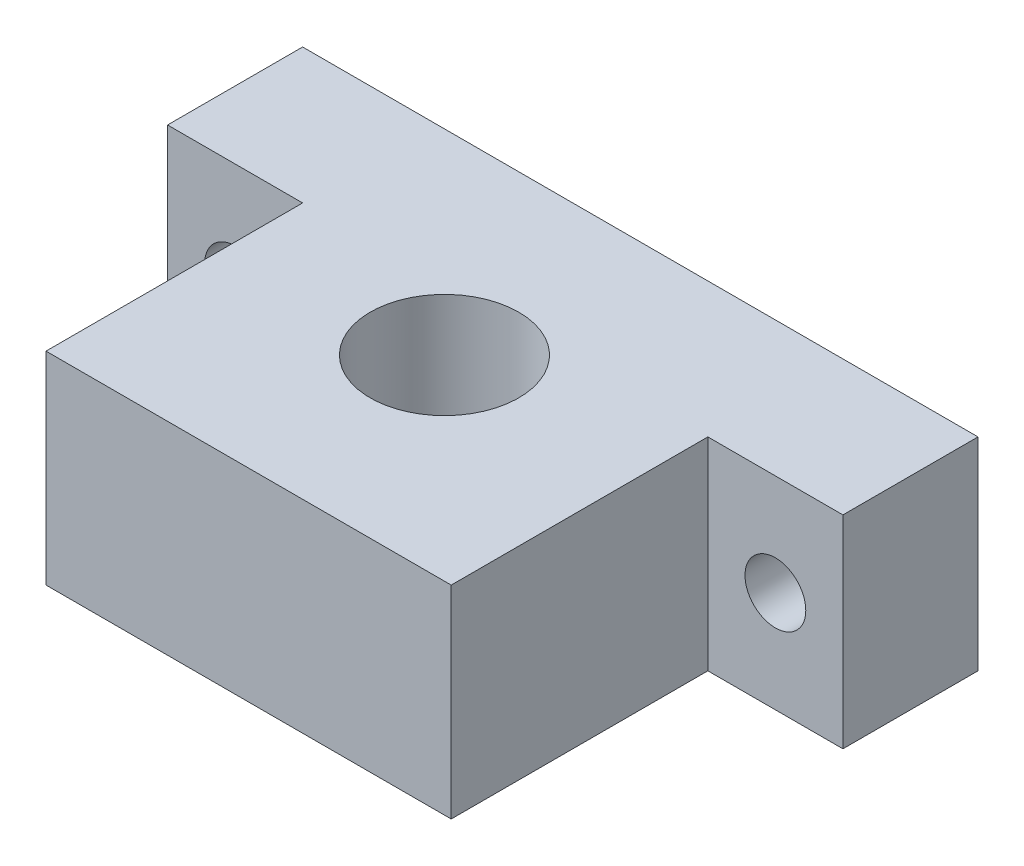
ISO-10303-21;
HEADER;
FILE_DESCRIPTION(('STEP AP214'),'2;1');
FILE_NAME('part.step','',(''),(''),'','','');
FILE_SCHEMA(('AUTOMOTIVE_DESIGN { 1 0 10303 214 1 1 1 1 }'));
ENDSEC;
DATA;
#1=APPLICATION_CONTEXT('core data for automotive mechanical design processes');
#2=APPLICATION_PROTOCOL_DEFINITION('international standard','automotive_design',2000,#1);
#3=PRODUCT_CONTEXT('',#1,'mechanical');
#4=PRODUCT('Part','Part','',(#3));
#5=PRODUCT_RELATED_PRODUCT_CATEGORY('part','',(#4));
#6=PRODUCT_DEFINITION_FORMATION('','',#4);
#7=PRODUCT_DEFINITION_CONTEXT('part definition',#1,'design');
#8=PRODUCT_DEFINITION('design','',#6,#7);
#9=PRODUCT_DEFINITION_SHAPE('','',#8);
#10=(LENGTH_UNIT() NAMED_UNIT(*) SI_UNIT(.MILLI.,.METRE.));
#11=(NAMED_UNIT(*) PLANE_ANGLE_UNIT() SI_UNIT($,.RADIAN.));
#12=(NAMED_UNIT(*) SI_UNIT($,.STERADIAN.) SOLID_ANGLE_UNIT());
#13=UNCERTAINTY_MEASURE_WITH_UNIT(LENGTH_MEASURE(1.E-05),#10,'distance_accuracy_value','');
#14=(GEOMETRIC_REPRESENTATION_CONTEXT(3) GLOBAL_UNCERTAINTY_ASSIGNED_CONTEXT((#13)) GLOBAL_UNIT_ASSIGNED_CONTEXT((#10,
#11,#12)) REPRESENTATION_CONTEXT('',''));
#15=CARTESIAN_POINT('',(0.,0.,0.));
#16=DIRECTION('',(0.,0.,1.));
#17=DIRECTION('',(1.,0.,0.));
#18=AXIS2_PLACEMENT_3D('',#15,#16,#17);
#19=CARTESIAN_POINT('',(35.873439743085,674.486311853786,132.704036074085));
#20=DIRECTION('',(-1.,0.,0.));
#21=DIRECTION('',(0.,0.,1.));
#22=AXIS2_PLACEMENT_3D('',#19,#20,#21);
#23=PLANE('',#22);
#24=DIRECTION('',(0.,-1.,0.));
#25=VECTOR('',#24,1.);
#26=CARTESIAN_POINT('',(35.873439743085,704.486311853786,-9.69902901502091));
#27=LINE('',#26,#25);
#28=CARTESIAN_POINT('',(35.873439743085,704.486311853786,-9.69902901502091));
#29=VERTEX_POINT('',#28);
#30=CARTESIAN_POINT('',(35.873439743085,674.486311853786,-9.69902901502091));
#31=VERTEX_POINT('',#30);
#32=EDGE_CURVE('E182',#29,#31,#27,.T.);
#33=ORIENTED_EDGE('',*,*,#32,.T.);
#34=DIRECTION('',(0.,0.,-1.));
#35=VECTOR('',#34,1.);
#36=CARTESIAN_POINT('',(35.873439743085,674.486311853786,132.704036074085));
#37=LINE('',#36,#35);
#38=CARTESIAN_POINT('',(35.873439743085,674.486311853786,-29.6990290150209));
#39=VERTEX_POINT('',#38);
#40=EDGE_CURVE('E147',#31,#39,#37,.T.);
#41=ORIENTED_EDGE('',*,*,#40,.T.);
#42=DIRECTION('',(0.,1.,0.));
#43=VECTOR('',#42,1.);
#44=CARTESIAN_POINT('',(35.873439743085,674.486311853786,-29.6990290150209));
#45=LINE('',#44,#43);
#46=CARTESIAN_POINT('',(35.873439743085,704.486311853786,-29.6990290150209));
#47=VERTEX_POINT('',#46);
#48=EDGE_CURVE('E144',#39,#47,#45,.T.);
#49=ORIENTED_EDGE('',*,*,#48,.T.);
#50=DIRECTION('',(0.,0.,-1.));
#51=VECTOR('',#50,1.);
#52=CARTESIAN_POINT('',(35.873439743085,704.486311853786,132.704036074085));
#53=LINE('',#52,#51);
#54=EDGE_CURVE('E143',#29,#47,#53,.T.);
#55=ORIENTED_EDGE('',*,*,#54,.F.);
#56=EDGE_LOOP('',(#33,#41,#49,#55));
#57=FACE_BOUND('',#56,.T.);
#58=ADVANCED_FACE('F35',(#57),#23,.F.);
#59=CARTESIAN_POINT('',(-64.1265602569151,704.486311853786,132.704036074085));
#60=DIRECTION('',(1.,0.,0.));
#61=DIRECTION('',(0.,0.,-1.));
#62=AXIS2_PLACEMENT_3D('',#59,#60,#61);
#63=PLANE('',#62);
#64=DIRECTION('',(0.,1.,0.));
#65=VECTOR('',#64,1.);
#66=CARTESIAN_POINT('',(-64.126560256915,704.486311853786,-9.69902901502091));
#67=LINE('',#66,#65);
#68=CARTESIAN_POINT('',(-64.1265602569151,674.486311853786,-9.69902901502091));
#69=VERTEX_POINT('',#68);
#70=CARTESIAN_POINT('',(-64.126560256915,704.486311853786,-9.69902901502091));
#71=VERTEX_POINT('',#70);
#72=EDGE_CURVE('E127',#69,#71,#67,.T.);
#73=ORIENTED_EDGE('',*,*,#72,.T.);
#74=DIRECTION('',(0.,0.,-1.));
#75=VECTOR('',#74,1.);
#76=CARTESIAN_POINT('',(-64.1265602569151,704.486311853786,132.704036074085));
#77=LINE('',#76,#75);
#78=CARTESIAN_POINT('',(-64.1265602569151,704.486311853786,-29.6990290150209));
#79=VERTEX_POINT('',#78);
#80=EDGE_CURVE('E39',#71,#79,#77,.T.);
#81=ORIENTED_EDGE('',*,*,#80,.T.);
#82=DIRECTION('',(0.,-1.,0.));
#83=VECTOR('',#82,1.);
#84=CARTESIAN_POINT('',(-64.1265602569151,704.486311853786,-29.6990290150209));
#85=LINE('',#84,#83);
#86=CARTESIAN_POINT('',(-64.1265602569151,674.486311853786,-29.6990290150209));
#87=VERTEX_POINT('',#86);
#88=EDGE_CURVE('E152',#79,#87,#85,.T.);
#89=ORIENTED_EDGE('',*,*,#88,.T.);
#90=DIRECTION('',(0.,0.,-1.));
#91=VECTOR('',#90,1.);
#92=CARTESIAN_POINT('',(-64.1265602569151,674.486311853786,132.704036074085));
#93=LINE('',#92,#91);
#94=EDGE_CURVE('E151',#69,#87,#93,.T.);
#95=ORIENTED_EDGE('',*,*,#94,.F.);
#96=EDGE_LOOP('',(#73,#81,#89,#95));
#97=FACE_BOUND('',#96,.T.);
#98=ADVANCED_FACE('F174',(#97),#63,.F.);
#99=CARTESIAN_POINT('',(-14.1265602569151,674.486311853786,132.704036074085));
#100=DIRECTION('',(0.,1.,0.));
#101=DIRECTION('',(0.,0.,1.));
#102=AXIS2_PLACEMENT_3D('',#99,#100,#101);
#103=PLANE('',#102);
#104=CARTESIAN_POINT('',(-14.126560256915,674.486311853786,-0.699029015020905));
#105=DIRECTION('',(0.,-1.,0.));
#106=DIRECTION('',(0.,0.,-1.));
#107=AXIS2_PLACEMENT_3D('',#104,#105,#106);
#108=CIRCLE('',#107,11.);
#109=CARTESIAN_POINT('',(-14.126560256915,674.486311853786,-11.6990290150209));
#110=VERTEX_POINT('',#109);
#111=EDGE_CURVE('E134',#110,#110,#108,.T.);
#112=ORIENTED_EDGE('',*,*,#111,.F.);
#113=EDGE_LOOP('',(#112));
#114=FACE_BOUND('',#113,.T.);
#115=DIRECTION('',(-1.,0.,0.));
#116=VECTOR('',#115,1.);
#117=CARTESIAN_POINT('',(35.873439743085,674.486311853786,-9.69902901502091));
#118=LINE('',#117,#116);
#119=CARTESIAN_POINT('',(15.8734397430849,674.486311853786,-9.69902901502091));
#120=VERTEX_POINT('',#119);
#121=EDGE_CURVE('E114',#31,#120,#118,.T.);
#122=ORIENTED_EDGE('',*,*,#121,.T.);
#123=DIRECTION('',(0.,0.,1.));
#124=VECTOR('',#123,1.);
#125=CARTESIAN_POINT('',(15.8734397430849,674.486311853786,-65.7545417696608));
#126=LINE('',#125,#124);
#127=CARTESIAN_POINT('',(15.8734397430849,674.486311853786,28.3009709849791));
#128=VERTEX_POINT('',#127);
#129=EDGE_CURVE('E103',#120,#128,#126,.T.);
#130=ORIENTED_EDGE('',*,*,#129,.T.);
#131=DIRECTION('',(1.,0.,0.));
#132=VECTOR('',#131,1.);
#133=CARTESIAN_POINT('',(-14.1265602569151,674.486311853786,28.3009709849791));
#134=LINE('',#133,#132);
#135=CARTESIAN_POINT('',(-44.126560256915,674.486311853786,28.3009709849791));
#136=VERTEX_POINT('',#135);
#137=EDGE_CURVE('E12',#136,#128,#134,.T.);
#138=ORIENTED_EDGE('',*,*,#137,.F.);
#139=DIRECTION('',(0.,0.,1.));
#140=VECTOR('',#139,1.);
#141=CARTESIAN_POINT('',(-44.126560256915,674.486311853786,-65.7545417696608));
#142=LINE('',#141,#140);
#143=CARTESIAN_POINT('',(-44.126560256915,674.486311853786,-9.69902901502091));
#144=VERTEX_POINT('',#143);
#145=EDGE_CURVE('E60',#144,#136,#142,.T.);
#146=ORIENTED_EDGE('',*,*,#145,.F.);
#147=DIRECTION('',(-1.,0.,0.));
#148=VECTOR('',#147,1.);
#149=CARTESIAN_POINT('',(-64.1265602569151,674.486311853786,-9.69902901502091));
#150=LINE('',#149,#148);
#151=EDGE_CURVE('E131',#144,#69,#150,.T.);
#152=ORIENTED_EDGE('',*,*,#151,.T.);
#153=ORIENTED_EDGE('',*,*,#94,.T.);
#154=DIRECTION('',(1.,0.,0.));
#155=VECTOR('',#154,1.);
#156=CARTESIAN_POINT('',(-14.1265602569151,674.486311853786,-29.6990290150209));
#157=LINE('',#156,#155);
#158=EDGE_CURVE('E148',#87,#39,#157,.T.);
#159=ORIENTED_EDGE('',*,*,#158,.T.);
#160=ORIENTED_EDGE('',*,*,#40,.F.);
#161=EDGE_LOOP('',(#122,#130,#138,#146,#152,#153,#159,#160));
#162=FACE_BOUND('',#161,.T.);
#163=ADVANCED_FACE('F112',(#114,#162),#103,.F.);
#164=CARTESIAN_POINT('',(35.873439743085,704.486311853786,132.704036074085));
#165=DIRECTION('',(0.,-1.,0.));
#166=DIRECTION('',(0.,0.,-1.));
#167=AXIS2_PLACEMENT_3D('',#164,#165,#166);
#168=PLANE('',#167);
#169=CARTESIAN_POINT('',(-14.126560256915,704.486311853786,-0.699029015020905));
#170=DIRECTION('',(0.,-1.,0.));
#171=DIRECTION('',(0.,0.,-1.));
#172=AXIS2_PLACEMENT_3D('',#169,#170,#171);
#173=CIRCLE('',#172,11.);
#174=CARTESIAN_POINT('',(-14.126560256915,704.486311853786,-11.6990290150209));
#175=VERTEX_POINT('',#174);
#176=EDGE_CURVE('E135',#175,#175,#173,.T.);
#177=ORIENTED_EDGE('',*,*,#176,.T.);
#178=EDGE_LOOP('',(#177));
#179=FACE_BOUND('',#178,.T.);
#180=DIRECTION('',(-1.,0.,0.));
#181=VECTOR('',#180,1.);
#182=CARTESIAN_POINT('',(35.873439743085,704.486311853786,28.3009709849791));
#183=LINE('',#182,#181);
#184=CARTESIAN_POINT('',(15.8734397430849,704.486311853786,28.3009709849791));
#185=VERTEX_POINT('',#184);
#186=CARTESIAN_POINT('',(-44.1265602569151,704.486311853786,28.3009709849791));
#187=VERTEX_POINT('',#186);
#188=EDGE_CURVE('E44',#185,#187,#183,.T.);
#189=ORIENTED_EDGE('',*,*,#188,.F.);
#190=DIRECTION('',(0.,0.,1.));
#191=VECTOR('',#190,1.);
#192=CARTESIAN_POINT('',(15.8734397430849,704.486311853786,-65.7545417696608));
#193=LINE('',#192,#191);
#194=CARTESIAN_POINT('',(15.8734397430849,704.486311853786,-9.69902901502091));
#195=VERTEX_POINT('',#194);
#196=EDGE_CURVE('E52',#195,#185,#193,.T.);
#197=ORIENTED_EDGE('',*,*,#196,.F.);
#198=DIRECTION('',(1.,0.,0.));
#199=VECTOR('',#198,1.);
#200=CARTESIAN_POINT('',(35.873439743085,704.486311853786,-9.69902901502091));
#201=LINE('',#200,#199);
#202=EDGE_CURVE('E123',#195,#29,#201,.T.);
#203=ORIENTED_EDGE('',*,*,#202,.T.);
#204=ORIENTED_EDGE('',*,*,#54,.T.);
#205=DIRECTION('',(-1.,0.,0.));
#206=VECTOR('',#205,1.);
#207=CARTESIAN_POINT('',(35.873439743085,704.486311853786,-29.6990290150209));
#208=LINE('',#207,#206);
#209=EDGE_CURVE('E140',#47,#79,#208,.T.);
#210=ORIENTED_EDGE('',*,*,#209,.T.);
#211=ORIENTED_EDGE('',*,*,#80,.F.);
#212=DIRECTION('',(1.,0.,0.));
#213=VECTOR('',#212,1.);
#214=CARTESIAN_POINT('',(-64.126560256915,704.486311853786,-9.69902901502091));
#215=LINE('',#214,#213);
#216=CARTESIAN_POINT('',(-44.1265602569151,704.486311853786,-9.69902901502091));
#217=VERTEX_POINT('',#216);
#218=EDGE_CURVE('E176',#71,#217,#215,.T.);
#219=ORIENTED_EDGE('',*,*,#218,.T.);
#220=DIRECTION('',(0.,0.,1.));
#221=VECTOR('',#220,1.);
#222=CARTESIAN_POINT('',(-44.1265602569151,704.486311853786,-65.7545417696608));
#223=LINE('',#222,#221);
#224=EDGE_CURVE('E121',#217,#187,#223,.T.);
#225=ORIENTED_EDGE('',*,*,#224,.T.);
#226=EDGE_LOOP('',(#189,#197,#203,#204,#210,#211,#219,#225));
#227=FACE_BOUND('',#226,.T.);
#228=ADVANCED_FACE('F160',(#179,#227),#168,.F.);
#229=CARTESIAN_POINT('',(0.,0.,-29.6990290150209));
#230=DIRECTION('',(0.,0.,1.));
#231=DIRECTION('',(1.,0.,0.));
#232=AXIS2_PLACEMENT_3D('',#229,#230,#231);
#233=PLANE('',#232);
#234=CARTESIAN_POINT('',(-54.126560256915,689.486311853786,-29.6990290150209));
#235=DIRECTION('',(0.,0.,1.));
#236=DIRECTION('',(1.,0.,0.));
#237=AXIS2_PLACEMENT_3D('',#234,#235,#236);
#238=CIRCLE('',#237,4.5);
#239=CARTESIAN_POINT('',(-49.626560256915,689.486311853786,-29.6990290150209));
#240=VERTEX_POINT('',#239);
#241=EDGE_CURVE('E190',#240,#240,#238,.T.);
#242=ORIENTED_EDGE('',*,*,#241,.T.);
#243=EDGE_LOOP('',(#242));
#244=FACE_BOUND('',#243,.T.);
#245=CARTESIAN_POINT('',(25.8734397430849,689.486311853786,-29.6990290150209));
#246=DIRECTION('',(0.,0.,1.));
#247=DIRECTION('',(1.,0.,0.));
#248=AXIS2_PLACEMENT_3D('',#245,#246,#247);
#249=CIRCLE('',#248,4.5);
#250=CARTESIAN_POINT('',(30.3734397430849,689.486311853786,-29.6990290150209));
#251=VERTEX_POINT('',#250);
#252=EDGE_CURVE('E107',#251,#251,#249,.T.);
#253=ORIENTED_EDGE('',*,*,#252,.T.);
#254=EDGE_LOOP('',(#253));
#255=FACE_BOUND('',#254,.T.);
#256=ORIENTED_EDGE('',*,*,#88,.F.);
#257=ORIENTED_EDGE('',*,*,#209,.F.);
#258=ORIENTED_EDGE('',*,*,#48,.F.);
#259=ORIENTED_EDGE('',*,*,#158,.F.);
#260=EDGE_LOOP('',(#256,#257,#258,#259));
#261=FACE_BOUND('',#260,.T.);
#262=ADVANCED_FACE('F170',(#244,#255,#261),#233,.F.);
#263=CARTESIAN_POINT('',(-14.1265602569151,126.071847680874,28.3009709849791));
#264=DIRECTION('',(0.,0.,1.));
#265=DIRECTION('',(0.,-1.,0.));
#266=AXIS2_PLACEMENT_3D('',#263,#264,#265);
#267=PLANE('',#266);
#268=DIRECTION('',(0.,-1.,0.));
#269=VECTOR('',#268,1.);
#270=CARTESIAN_POINT('',(15.8734397430849,704.486311853786,28.3009709849791));
#271=LINE('',#270,#269);
#272=EDGE_CURVE('E100',#185,#128,#271,.T.);
#273=ORIENTED_EDGE('',*,*,#272,.F.);
#274=ORIENTED_EDGE('',*,*,#188,.T.);
#275=DIRECTION('',(0.,1.,0.));
#276=VECTOR('',#275,1.);
#277=CARTESIAN_POINT('',(-44.1265602569151,704.486311853786,28.3009709849791));
#278=LINE('',#277,#276);
#279=EDGE_CURVE('E116',#136,#187,#278,.T.);
#280=ORIENTED_EDGE('',*,*,#279,.F.);
#281=ORIENTED_EDGE('',*,*,#137,.T.);
#282=EDGE_LOOP('',(#273,#274,#280,#281));
#283=FACE_BOUND('',#282,.T.);
#284=ADVANCED_FACE('F37',(#283),#267,.T.);
#285=CARTESIAN_POINT('',(-14.126560256915,704.486311853786,-0.699029015020905));
#286=DIRECTION('',(0.,-1.,0.));
#287=DIRECTION('',(0.,0.,-1.));
#288=AXIS2_PLACEMENT_3D('',#285,#286,#287);
#289=CYLINDRICAL_SURFACE('',#288,11.);
#290=ORIENTED_EDGE('',*,*,#176,.F.);
#291=EDGE_LOOP('',(#290));
#292=FACE_BOUND('',#291,.T.);
#293=ORIENTED_EDGE('',*,*,#111,.T.);
#294=EDGE_LOOP('',(#293));
#295=FACE_BOUND('',#294,.T.);
#296=ADVANCED_FACE('F205',(#292,#295),#289,.F.);
#297=CARTESIAN_POINT('',(-44.1265602569151,704.486311853786,-65.7545417696608));
#298=DIRECTION('',(1.,0.,0.));
#299=DIRECTION('',(0.,1.,0.));
#300=AXIS2_PLACEMENT_3D('',#297,#298,#299);
#301=PLANE('',#300);
#302=DIRECTION('',(0.,-1.,0.));
#303=VECTOR('',#302,1.);
#304=CARTESIAN_POINT('',(-44.1265602569151,704.486311853786,-9.69902901502091));
#305=LINE('',#304,#303);
#306=EDGE_CURVE('E129',#217,#144,#305,.T.);
#307=ORIENTED_EDGE('',*,*,#306,.T.);
#308=ORIENTED_EDGE('',*,*,#145,.T.);
#309=ORIENTED_EDGE('',*,*,#279,.T.);
#310=ORIENTED_EDGE('',*,*,#224,.F.);
#311=EDGE_LOOP('',(#307,#308,#309,#310));
#312=FACE_BOUND('',#311,.T.);
#313=ADVANCED_FACE('F201',(#312),#301,.F.);
#314=CARTESIAN_POINT('',(0.,0.,-9.69902901502091));
#315=DIRECTION('',(0.,0.,1.));
#316=DIRECTION('',(1.,0.,0.));
#317=AXIS2_PLACEMENT_3D('',#314,#315,#316);
#318=PLANE('',#317);
#319=CARTESIAN_POINT('',(-54.126560256915,689.486311853786,-9.6990290150209));
#320=DIRECTION('',(0.,0.,1.));
#321=DIRECTION('',(1.,0.,0.));
#322=AXIS2_PLACEMENT_3D('',#319,#320,#321);
#323=CIRCLE('',#322,4.49999999999999);
#324=CARTESIAN_POINT('',(-49.6265602569151,689.486311853786,-9.6990290150209));
#325=VERTEX_POINT('',#324);
#326=EDGE_CURVE('E193',#325,#325,#323,.T.);
#327=ORIENTED_EDGE('',*,*,#326,.F.);
#328=EDGE_LOOP('',(#327));
#329=FACE_BOUND('',#328,.T.);
#330=ORIENTED_EDGE('',*,*,#72,.F.);
#331=ORIENTED_EDGE('',*,*,#151,.F.);
#332=ORIENTED_EDGE('',*,*,#306,.F.);
#333=ORIENTED_EDGE('',*,*,#218,.F.);
#334=EDGE_LOOP('',(#330,#331,#332,#333));
#335=FACE_BOUND('',#334,.T.);
#336=ADVANCED_FACE('F199',(#329,#335),#318,.T.);
#337=CARTESIAN_POINT('',(15.8734397430849,704.486311853786,-65.7545417696608));
#338=DIRECTION('',(-1.,0.,0.));
#339=DIRECTION('',(0.,0.,1.));
#340=AXIS2_PLACEMENT_3D('',#337,#338,#339);
#341=PLANE('',#340);
#342=DIRECTION('',(0.,1.,0.));
#343=VECTOR('',#342,1.);
#344=CARTESIAN_POINT('',(15.8734397430849,704.486311853786,-9.69902901502091));
#345=LINE('',#344,#343);
#346=EDGE_CURVE('E119',#120,#195,#345,.T.);
#347=ORIENTED_EDGE('',*,*,#346,.T.);
#348=ORIENTED_EDGE('',*,*,#196,.T.);
#349=ORIENTED_EDGE('',*,*,#272,.T.);
#350=ORIENTED_EDGE('',*,*,#129,.F.);
#351=EDGE_LOOP('',(#347,#348,#349,#350));
#352=FACE_BOUND('',#351,.T.);
#353=ADVANCED_FACE('F102',(#352),#341,.F.);
#354=CARTESIAN_POINT('',(0.,0.,-9.69902901502091));
#355=DIRECTION('',(0.,0.,1.));
#356=DIRECTION('',(1.,0.,0.));
#357=AXIS2_PLACEMENT_3D('',#354,#355,#356);
#358=PLANE('',#357);
#359=CARTESIAN_POINT('',(25.8734397430849,689.486311853786,-9.6990290150209));
#360=DIRECTION('',(0.,0.,1.));
#361=DIRECTION('',(1.,0.,0.));
#362=AXIS2_PLACEMENT_3D('',#359,#360,#361);
#363=CIRCLE('',#362,4.49999999999999);
#364=CARTESIAN_POINT('',(30.3734397430849,689.486311853786,-9.6990290150209));
#365=VERTEX_POINT('',#364);
#366=EDGE_CURVE('E187',#365,#365,#363,.T.);
#367=ORIENTED_EDGE('',*,*,#366,.F.);
#368=EDGE_LOOP('',(#367));
#369=FACE_BOUND('',#368,.T.);
#370=ORIENTED_EDGE('',*,*,#202,.F.);
#371=ORIENTED_EDGE('',*,*,#346,.F.);
#372=ORIENTED_EDGE('',*,*,#121,.F.);
#373=ORIENTED_EDGE('',*,*,#32,.F.);
#374=EDGE_LOOP('',(#370,#371,#372,#373));
#375=FACE_BOUND('',#374,.T.);
#376=ADVANCED_FACE('F243',(#369,#375),#358,.T.);
#377=CARTESIAN_POINT('',(25.8734397430849,689.486311853786,-9.69902901502091));
#378=DIRECTION('',(0.,0.,1.));
#379=DIRECTION('',(1.,0.,0.));
#380=AXIS2_PLACEMENT_3D('',#377,#378,#379);
#381=CYLINDRICAL_SURFACE('',#380,4.49999999999999);
#382=ORIENTED_EDGE('',*,*,#252,.F.);
#383=EDGE_LOOP('',(#382));
#384=FACE_BOUND('',#383,.T.);
#385=ORIENTED_EDGE('',*,*,#366,.T.);
#386=EDGE_LOOP('',(#385));
#387=FACE_BOUND('',#386,.T.);
#388=ADVANCED_FACE('F240',(#384,#387),#381,.F.);
#389=CARTESIAN_POINT('',(-54.126560256915,689.486311853786,-9.69902901502091));
#390=DIRECTION('',(0.,0.,1.));
#391=DIRECTION('',(1.,0.,0.));
#392=AXIS2_PLACEMENT_3D('',#389,#390,#391);
#393=CYLINDRICAL_SURFACE('',#392,4.49999999999999);
#394=ORIENTED_EDGE('',*,*,#241,.F.);
#395=EDGE_LOOP('',(#394));
#396=FACE_BOUND('',#395,.T.);
#397=ORIENTED_EDGE('',*,*,#326,.T.);
#398=EDGE_LOOP('',(#397));
#399=FACE_BOUND('',#398,.T.);
#400=ADVANCED_FACE('F197',(#396,#399),#393,.F.);
#401=CLOSED_SHELL('',(#58,#98,#163,#228,#262,#284,#296,#313,#336,#353,#376,#388,#400));
#402=MANIFOLD_SOLID_BREP('B2',#401);
#403=ADVANCED_BREP_SHAPE_REPRESENTATION('',(#18,#402),#14);
#404=SHAPE_DEFINITION_REPRESENTATION(#9,#403);
ENDSEC;
END-ISO-10303-21;
